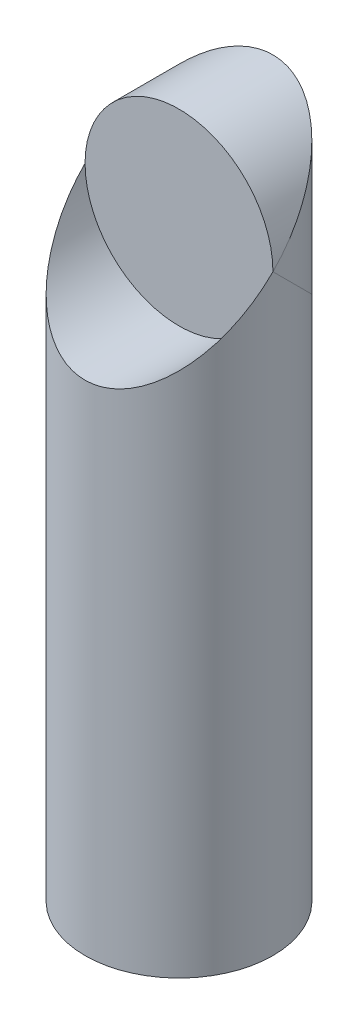
ISO-10303-21;
HEADER;
FILE_DESCRIPTION(('STEP AP214'),'2;1');
FILE_NAME('part.step','',(''),(''),'','','');
FILE_SCHEMA(('AUTOMOTIVE_DESIGN { 1 0 10303 214 1 1 1 1 }'));
ENDSEC;
DATA;
#1=APPLICATION_CONTEXT('core data for automotive mechanical design processes');
#2=APPLICATION_PROTOCOL_DEFINITION('international standard','automotive_design',2000,#1);
#3=PRODUCT_CONTEXT('',#1,'mechanical');
#4=PRODUCT('Part','Part','',(#3));
#5=PRODUCT_RELATED_PRODUCT_CATEGORY('part','',(#4));
#6=PRODUCT_DEFINITION_FORMATION('','',#4);
#7=PRODUCT_DEFINITION_CONTEXT('part definition',#1,'design');
#8=PRODUCT_DEFINITION('design','',#6,#7);
#9=PRODUCT_DEFINITION_SHAPE('','',#8);
#10=(LENGTH_UNIT() NAMED_UNIT(*) SI_UNIT(.MILLI.,.METRE.));
#11=(NAMED_UNIT(*) PLANE_ANGLE_UNIT() SI_UNIT($,.RADIAN.));
#12=(NAMED_UNIT(*) SI_UNIT($,.STERADIAN.) SOLID_ANGLE_UNIT());
#13=UNCERTAINTY_MEASURE_WITH_UNIT(LENGTH_MEASURE(1.E-05),#10,'distance_accuracy_value','');
#14=(GEOMETRIC_REPRESENTATION_CONTEXT(3) GLOBAL_UNCERTAINTY_ASSIGNED_CONTEXT((#13)) GLOBAL_UNIT_ASSIGNED_CONTEXT((#10,
#11,#12)) REPRESENTATION_CONTEXT('',''));
#15=CARTESIAN_POINT('',(0.,0.,0.));
#16=DIRECTION('',(0.,0.,1.));
#17=DIRECTION('',(1.,0.,0.));
#18=AXIS2_PLACEMENT_3D('',#15,#16,#17);
#19=CARTESIAN_POINT('',(0.,145.,-23.0009999999997));
#20=DIRECTION('',(0.,0.,1.));
#21=DIRECTION('',(1.,0.,0.));
#22=AXIS2_PLACEMENT_3D('',#19,#20,#21);
#23=CYLINDRICAL_SURFACE('',#22,22.9999999999997);
#24=CARTESIAN_POINT('',(0.,145.,0.));
#25=DIRECTION('',(0.,-0.707106781186547,0.707106781186547));
#26=DIRECTION('',(0.,0.707106781186547,0.707106781186547));
#27=AXIS2_PLACEMENT_3D('',#24,#25,#26);
#28=ELLIPSE('',#27,32.5269119345808,22.9999999999997);
#29=CARTESIAN_POINT('',(22.9999999999997,145.,0.));
#30=VERTEX_POINT('',#29);
#31=CARTESIAN_POINT('',(-22.9999999999997,145.,0.));
#32=VERTEX_POINT('',#31);
#33=EDGE_CURVE('E54',#30,#32,#28,.F.);
#34=ORIENTED_EDGE('',*,*,#33,.F.);
#35=CARTESIAN_POINT('',(0.,145.,0.));
#36=DIRECTION('',(0.,0.,1.));
#37=DIRECTION('',(1.,0.,0.));
#38=AXIS2_PLACEMENT_3D('',#35,#36,#37);
#39=CIRCLE('',#38,22.9999999999997);
#40=EDGE_CURVE('E65',#32,#30,#39,.T.);
#41=ORIENTED_EDGE('',*,*,#40,.F.);
#42=EDGE_LOOP('',(#34,#41));
#43=FACE_BOUND('',#42,.T.);
#44=ADVANCED_FACE('F45',(#43),#23,.T.);
#45=CARTESIAN_POINT('',(0.,145.,0.));
#46=DIRECTION('',(0.,0.707106781186547,0.707106781186547));
#47=DIRECTION('',(0.,-0.707106781186547,0.707106781186547));
#48=AXIS2_PLACEMENT_3D('',#45,#46,#47);
#49=ELLIPSE('',#48,32.5269119345808,22.9999999999997);
#50=EDGE_CURVE('E12',#32,#30,#49,.F.);
#51=ORIENTED_EDGE('',*,*,#50,.F.);
#52=EDGE_CURVE('E49',#30,#32,#39,.T.);
#53=ORIENTED_EDGE('',*,*,#52,.F.);
#54=EDGE_LOOP('',(#51,#53));
#55=FACE_BOUND('',#54,.T.);
#56=ADVANCED_FACE('F47',(#55),#23,.T.);
#57=CARTESIAN_POINT('',(0.,145.,0.));
#58=DIRECTION('',(0.,0.,1.));
#59=DIRECTION('',(1.,0.,0.));
#60=AXIS2_PLACEMENT_3D('',#57,#58,#59);
#61=PLANE('',#60);
#62=ORIENTED_EDGE('',*,*,#52,.T.);
#63=ORIENTED_EDGE('',*,*,#40,.T.);
#64=EDGE_LOOP('',(#62,#63));
#65=FACE_BOUND('',#64,.T.);
#66=ADVANCED_FACE('F69',(#65),#61,.T.);
#67=CARTESIAN_POINT('',(0.,145.,0.));
#68=DIRECTION('',(0.,-1.,0.));
#69=DIRECTION('',(0.,0.,-1.));
#70=AXIS2_PLACEMENT_3D('',#67,#68,#69);
#71=CYLINDRICAL_SURFACE('',#70,22.9999999999997);
#72=ORIENTED_EDGE('',*,*,#33,.T.);
#73=ORIENTED_EDGE('',*,*,#50,.T.);
#74=EDGE_LOOP('',(#72,#73));
#75=FACE_BOUND('',#74,.T.);
#76=ADVANCED_FACE('F62',(#75),#71,.T.);
#77=CLOSED_SHELL('',(#44,#56,#66,#76));
#78=MANIFOLD_SOLID_BREP('B2',#77);
#79=CARTESIAN_POINT('',(0.,145.,0.));
#80=DIRECTION('',(0.,-1.,0.));
#81=DIRECTION('',(0.,0.,-1.));
#82=AXIS2_PLACEMENT_3D('',#79,#80,#81);
#83=CYLINDRICAL_SURFACE('',#82,22.9999999999997);
#84=CARTESIAN_POINT('',(0.,0.,0.));
#85=DIRECTION('',(0.,1.,0.));
#86=DIRECTION('',(0.,0.,1.));
#87=AXIS2_PLACEMENT_3D('',#84,#85,#86);
#88=CIRCLE('',#87,22.9999999999997);
#89=CARTESIAN_POINT('',(0.,0.,22.9999999999997));
#90=VERTEX_POINT('',#89);
#91=EDGE_CURVE('E43',#90,#90,#88,.T.);
#92=ORIENTED_EDGE('',*,*,#91,.T.);
#93=EDGE_LOOP('',(#92));
#94=FACE_BOUND('',#93,.T.);
#95=CARTESIAN_POINT('',(0.,145.,0.));
#96=DIRECTION('',(0.,-0.707106781186547,0.707106781186547));
#97=DIRECTION('',(0.,-0.707106781186547,-0.707106781186547));
#98=AXIS2_PLACEMENT_3D('',#95,#96,#97);
#99=ELLIPSE('',#98,32.5269119345808,22.9999999999997);
#100=CARTESIAN_POINT('',(-22.9999999999997,145.,0.));
#101=VERTEX_POINT('',#100);
#102=CARTESIAN_POINT('',(22.9999999999997,145.,0.));
#103=VERTEX_POINT('',#102);
#104=EDGE_CURVE('E110',#101,#103,#99,.T.);
#105=ORIENTED_EDGE('',*,*,#104,.T.);
#106=CARTESIAN_POINT('',(0.,145.,0.));
#107=DIRECTION('',(0.,-0.707106781186547,-0.707106781186547));
#108=DIRECTION('',(0.,-0.707106781186547,0.707106781186547));
#109=AXIS2_PLACEMENT_3D('',#106,#107,#108);
#110=ELLIPSE('',#109,32.5269119345808,22.9999999999997);
#111=EDGE_CURVE('E118',#103,#101,#110,.T.);
#112=ORIENTED_EDGE('',*,*,#111,.T.);
#113=EDGE_LOOP('',(#105,#112));
#114=FACE_BOUND('',#113,.T.);
#115=ADVANCED_FACE('F103',(#94,#114),#83,.T.);
#116=CARTESIAN_POINT('',(0.,0.,0.));
#117=DIRECTION('',(0.,1.,0.));
#118=DIRECTION('',(0.,0.,1.));
#119=AXIS2_PLACEMENT_3D('',#116,#117,#118);
#120=PLANE('',#119);
#121=ORIENTED_EDGE('',*,*,#91,.F.);
#122=EDGE_LOOP('',(#121));
#123=FACE_BOUND('',#122,.T.);
#124=ADVANCED_FACE('F122',(#123),#120,.F.);
#125=CARTESIAN_POINT('',(0.,145.,-22.9999999999997));
#126=DIRECTION('',(0.,0.,1.));
#127=DIRECTION('',(1.,0.,0.));
#128=AXIS2_PLACEMENT_3D('',#125,#126,#127);
#129=CYLINDRICAL_SURFACE('',#128,22.9999999999997);
#130=ORIENTED_EDGE('',*,*,#111,.F.);
#131=ORIENTED_EDGE('',*,*,#104,.F.);
#132=EDGE_LOOP('',(#130,#131));
#133=FACE_BOUND('',#132,.T.);
#134=ADVANCED_FACE('F119',(#133),#129,.F.);
#135=CLOSED_SHELL('',(#115,#124,#134));
#136=MANIFOLD_SOLID_BREP('B6',#135);
#137=ADVANCED_BREP_SHAPE_REPRESENTATION('',(#18,#78,#136),#14);
#138=SHAPE_DEFINITION_REPRESENTATION(#9,#137);
ENDSEC;
END-ISO-10303-21;
